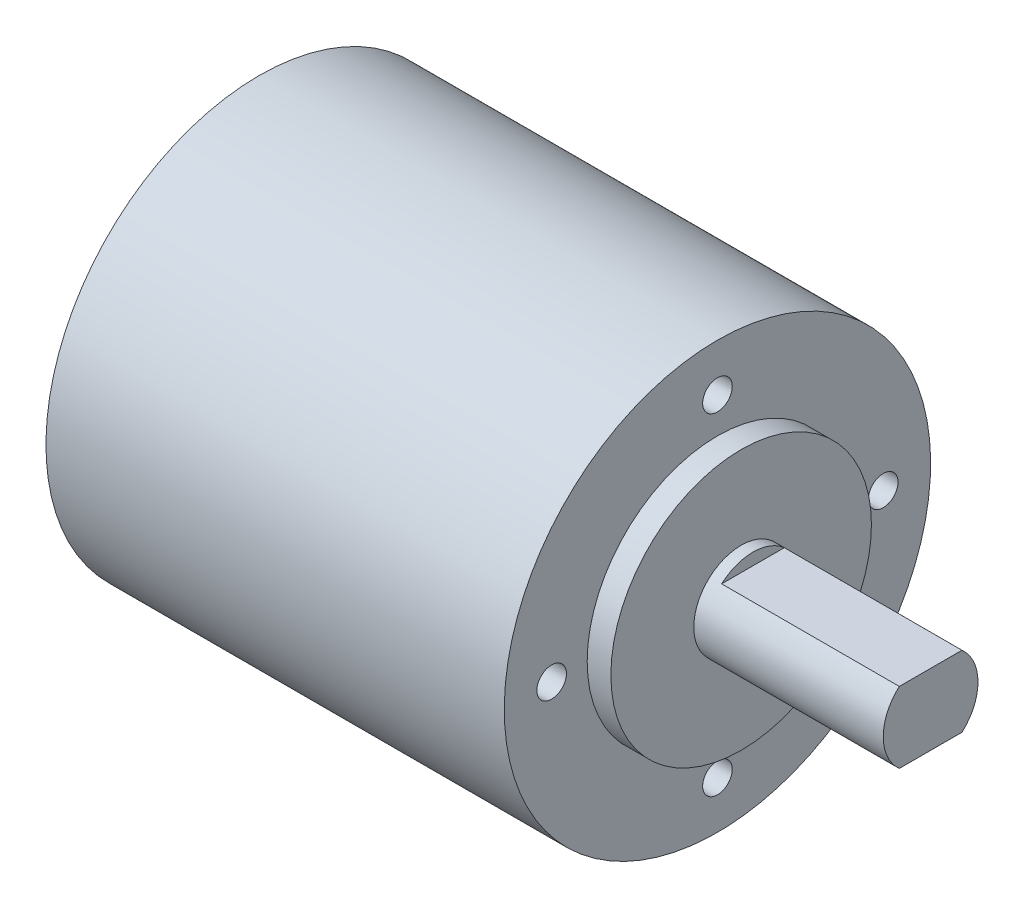
ISO-10303-21;
HEADER;
FILE_DESCRIPTION(('STEP AP214'),'2;1');
FILE_NAME('part.step','',(''),(''),'','','');
FILE_SCHEMA(('AUTOMOTIVE_DESIGN { 1 0 10303 214 1 1 1 1 }'));
ENDSEC;
DATA;
#1=APPLICATION_CONTEXT('core data for automotive mechanical design processes');
#2=APPLICATION_PROTOCOL_DEFINITION('international standard','automotive_design',2000,#1);
#3=PRODUCT_CONTEXT('',#1,'mechanical');
#4=PRODUCT('Part','Part','',(#3));
#5=PRODUCT_RELATED_PRODUCT_CATEGORY('part','',(#4));
#6=PRODUCT_DEFINITION_FORMATION('','',#4);
#7=PRODUCT_DEFINITION_CONTEXT('part definition',#1,'design');
#8=PRODUCT_DEFINITION('design','',#6,#7);
#9=PRODUCT_DEFINITION_SHAPE('','',#8);
#10=(LENGTH_UNIT() NAMED_UNIT(*) SI_UNIT(.MILLI.,.METRE.));
#11=(NAMED_UNIT(*) PLANE_ANGLE_UNIT() SI_UNIT($,.RADIAN.));
#12=(NAMED_UNIT(*) SI_UNIT($,.STERADIAN.) SOLID_ANGLE_UNIT());
#13=UNCERTAINTY_MEASURE_WITH_UNIT(LENGTH_MEASURE(1.E-05),#10,'distance_accuracy_value','');
#14=(GEOMETRIC_REPRESENTATION_CONTEXT(3) GLOBAL_UNCERTAINTY_ASSIGNED_CONTEXT((#13)) GLOBAL_UNIT_ASSIGNED_CONTEXT((#10,
#11,#12)) REPRESENTATION_CONTEXT('',''));
#15=CARTESIAN_POINT('',(0.,0.,0.));
#16=DIRECTION('',(0.,0.,1.));
#17=DIRECTION('',(1.,0.,0.));
#18=AXIS2_PLACEMENT_3D('',#15,#16,#17);
#19=CARTESIAN_POINT('',(56.7,0.,0.));
#20=DIRECTION('',(1.,0.,0.));
#21=DIRECTION('',(0.,1.,0.));
#22=AXIS2_PLACEMENT_3D('',#19,#20,#21);
#23=CYLINDRICAL_SURFACE('',#22,4.);
#24=DIRECTION('',(1.,0.,0.));
#25=VECTOR('',#24,1.);
#26=CARTESIAN_POINT('',(41.7,-3.00000000000001,-2.64575131106459));
#27=LINE('',#26,#25);
#28=CARTESIAN_POINT('',(41.7,-3.00000000000001,-2.64575131106459));
#29=VERTEX_POINT('',#28);
#30=CARTESIAN_POINT('',(56.7,-3.00000000000001,-2.64575131106459));
#31=VERTEX_POINT('',#30);
#32=EDGE_CURVE('E102',#29,#31,#27,.T.);
#33=ORIENTED_EDGE('',*,*,#32,.F.);
#34=CARTESIAN_POINT('',(41.7,0.,0.));
#35=DIRECTION('',(-1.,0.,0.));
#36=DIRECTION('',(0.,-1.,0.));
#37=AXIS2_PLACEMENT_3D('',#34,#35,#36);
#38=CIRCLE('',#37,4.);
#39=CARTESIAN_POINT('',(41.7,-3.,2.64575131106459));
#40=VERTEX_POINT('',#39);
#41=EDGE_CURVE('E108',#29,#40,#38,.T.);
#42=ORIENTED_EDGE('',*,*,#41,.T.);
#43=DIRECTION('',(1.,0.,0.));
#44=VECTOR('',#43,1.);
#45=CARTESIAN_POINT('',(41.7,-3.,2.64575131106459));
#46=LINE('',#45,#44);
#47=CARTESIAN_POINT('',(56.7,-3.,2.64575131106459));
#48=VERTEX_POINT('',#47);
#49=EDGE_CURVE('E105',#40,#48,#46,.T.);
#50=ORIENTED_EDGE('',*,*,#49,.T.);
#51=CARTESIAN_POINT('',(56.7,0.,0.));
#52=DIRECTION('',(1.,0.,0.));
#53=DIRECTION('',(0.,1.,0.));
#54=AXIS2_PLACEMENT_3D('',#51,#52,#53);
#55=CIRCLE('',#54,4.);
#56=CARTESIAN_POINT('',(56.7,3.,2.64575131106459));
#57=VERTEX_POINT('',#56);
#58=EDGE_CURVE('E12',#57,#48,#55,.T.);
#59=ORIENTED_EDGE('',*,*,#58,.F.);
#60=DIRECTION('',(1.,0.,0.));
#61=VECTOR('',#60,1.);
#62=CARTESIAN_POINT('',(41.7,3.,2.64575131106459));
#63=LINE('',#62,#61);
#64=CARTESIAN_POINT('',(41.7,3.,2.64575131106459));
#65=VERTEX_POINT('',#64);
#66=EDGE_CURVE('E71',#65,#57,#63,.T.);
#67=ORIENTED_EDGE('',*,*,#66,.F.);
#68=CARTESIAN_POINT('',(41.7,0.,0.));
#69=DIRECTION('',(1.,0.,0.));
#70=DIRECTION('',(0.,1.,0.));
#71=AXIS2_PLACEMENT_3D('',#68,#69,#70);
#72=CIRCLE('',#71,4.);
#73=CARTESIAN_POINT('',(41.7,3.,-2.6457513110646));
#74=VERTEX_POINT('',#73);
#75=EDGE_CURVE('E78',#74,#65,#72,.T.);
#76=ORIENTED_EDGE('',*,*,#75,.F.);
#77=DIRECTION('',(1.,0.,0.));
#78=VECTOR('',#77,1.);
#79=CARTESIAN_POINT('',(41.7,3.,-2.6457513110646));
#80=LINE('',#79,#78);
#81=CARTESIAN_POINT('',(56.7,3.,-2.6457513110646));
#82=VERTEX_POINT('',#81);
#83=EDGE_CURVE('E120',#74,#82,#80,.T.);
#84=ORIENTED_EDGE('',*,*,#83,.T.);
#85=EDGE_CURVE('E64',#31,#82,#55,.T.);
#86=ORIENTED_EDGE('',*,*,#85,.F.);
#87=EDGE_LOOP('',(#33,#42,#50,#59,#67,#76,#84,#86));
#88=FACE_BOUND('',#87,.T.);
#89=CARTESIAN_POINT('',(40.7,0.,0.));
#90=DIRECTION('',(1.,0.,0.));
#91=DIRECTION('',(0.,1.,0.));
#92=AXIS2_PLACEMENT_3D('',#89,#90,#91);
#93=CIRCLE('',#92,4.);
#94=CARTESIAN_POINT('',(40.7,4.,0.));
#95=VERTEX_POINT('',#94);
#96=EDGE_CURVE('E127',#95,#95,#93,.T.);
#97=ORIENTED_EDGE('',*,*,#96,.T.);
#98=EDGE_LOOP('',(#97));
#99=FACE_BOUND('',#98,.T.);
#100=ADVANCED_FACE('F57',(#88,#99),#23,.T.);
#101=CARTESIAN_POINT('',(56.7,4.,0.));
#102=DIRECTION('',(1.,0.,0.));
#103=DIRECTION('',(0.,1.,0.));
#104=AXIS2_PLACEMENT_3D('',#101,#102,#103);
#105=PLANE('',#104);
#106=DIRECTION('',(0.,0.,-1.));
#107=VECTOR('',#106,1.);
#108=CARTESIAN_POINT('',(56.7,-3.,2.64575131106459));
#109=LINE('',#108,#107);
#110=EDGE_CURVE('E109',#48,#31,#109,.T.);
#111=ORIENTED_EDGE('',*,*,#110,.T.);
#112=ORIENTED_EDGE('',*,*,#85,.T.);
#113=DIRECTION('',(0.,0.,-1.));
#114=VECTOR('',#113,1.);
#115=CARTESIAN_POINT('',(56.7,3.,2.64575131106459));
#116=LINE('',#115,#114);
#117=EDGE_CURVE('E122',#57,#82,#116,.T.);
#118=ORIENTED_EDGE('',*,*,#117,.F.);
#119=ORIENTED_EDGE('',*,*,#58,.T.);
#120=EDGE_LOOP('',(#111,#112,#118,#119));
#121=FACE_BOUND('',#120,.T.);
#122=ADVANCED_FACE('F131',(#121),#105,.T.);
#123=CARTESIAN_POINT('',(40.7,4.,0.));
#124=DIRECTION('',(-1.,0.,0.));
#125=DIRECTION('',(0.,-1.,0.));
#126=AXIS2_PLACEMENT_3D('',#123,#124,#125);
#127=PLANE('',#126);
#128=ORIENTED_EDGE('',*,*,#96,.F.);
#129=EDGE_LOOP('',(#128));
#130=FACE_BOUND('',#129,.T.);
#131=ADVANCED_FACE('F143',(#130),#127,.T.);
#132=CARTESIAN_POINT('',(41.7,3.,2.64575131106459));
#133=DIRECTION('',(0.,-1.,0.));
#134=DIRECTION('',(1.,0.,0.));
#135=AXIS2_PLACEMENT_3D('',#132,#133,#134);
#136=PLANE('',#135);
#137=ORIENTED_EDGE('',*,*,#117,.T.);
#138=ORIENTED_EDGE('',*,*,#83,.F.);
#139=DIRECTION('',(0.,0.,-1.));
#140=VECTOR('',#139,1.);
#141=CARTESIAN_POINT('',(41.7,3.,2.64575131106459));
#142=LINE('',#141,#140);
#143=EDGE_CURVE('E124',#65,#74,#142,.T.);
#144=ORIENTED_EDGE('',*,*,#143,.F.);
#145=ORIENTED_EDGE('',*,*,#66,.T.);
#146=EDGE_LOOP('',(#137,#138,#144,#145));
#147=FACE_BOUND('',#146,.T.);
#148=ADVANCED_FACE('F134',(#147),#136,.F.);
#149=CARTESIAN_POINT('',(41.7,0.,0.));
#150=DIRECTION('',(1.,0.,0.));
#151=DIRECTION('',(0.,1.,0.));
#152=AXIS2_PLACEMENT_3D('',#149,#150,#151);
#153=PLANE('',#152);
#154=ORIENTED_EDGE('',*,*,#143,.T.);
#155=ORIENTED_EDGE('',*,*,#75,.T.);
#156=EDGE_LOOP('',(#154,#155));
#157=FACE_BOUND('',#156,.T.);
#158=ADVANCED_FACE('F135',(#157),#153,.T.);
#159=CARTESIAN_POINT('',(41.7,-3.,2.64575131106459));
#160=DIRECTION('',(0.,-1.,0.));
#161=DIRECTION('',(1.,0.,0.));
#162=AXIS2_PLACEMENT_3D('',#159,#160,#161);
#163=PLANE('',#162);
#164=ORIENTED_EDGE('',*,*,#110,.F.);
#165=ORIENTED_EDGE('',*,*,#49,.F.);
#166=DIRECTION('',(0.,0.,-1.));
#167=VECTOR('',#166,1.);
#168=CARTESIAN_POINT('',(41.7,-3.,2.64575131106459));
#169=LINE('',#168,#167);
#170=EDGE_CURVE('E98',#40,#29,#169,.T.);
#171=ORIENTED_EDGE('',*,*,#170,.T.);
#172=ORIENTED_EDGE('',*,*,#32,.T.);
#173=EDGE_LOOP('',(#164,#165,#171,#172));
#174=FACE_BOUND('',#173,.T.);
#175=ADVANCED_FACE('F100',(#174),#163,.T.);
#176=CARTESIAN_POINT('',(41.7,0.,0.));
#177=DIRECTION('',(1.,0.,0.));
#178=DIRECTION('',(0.,-1.,0.));
#179=AXIS2_PLACEMENT_3D('',#176,#177,#178);
#180=PLANE('',#179);
#181=ORIENTED_EDGE('',*,*,#41,.F.);
#182=ORIENTED_EDGE('',*,*,#170,.F.);
#183=EDGE_LOOP('',(#181,#182));
#184=FACE_BOUND('',#183,.T.);
#185=ADVANCED_FACE('F111',(#184),#180,.T.);
#186=CLOSED_SHELL('',(#100,#122,#131,#148,#158,#175,#185));
#187=MANIFOLD_SOLID_BREP('B2',#186);
#188=CARTESIAN_POINT('',(40.7,0.,0.));
#189=DIRECTION('',(1.,0.,0.));
#190=DIRECTION('',(0.,1.,0.));
#191=AXIS2_PLACEMENT_3D('',#188,#189,#190);
#192=CYLINDRICAL_SURFACE('',#191,18.);
#193=CARTESIAN_POINT('',(0.,0.,0.));
#194=DIRECTION('',(1.,0.,0.));
#195=DIRECTION('',(0.,1.,0.));
#196=AXIS2_PLACEMENT_3D('',#193,#194,#195);
#197=CIRCLE('',#196,18.);
#198=CARTESIAN_POINT('',(0.,18.,0.));
#199=VERTEX_POINT('',#198);
#200=EDGE_CURVE('E296',#199,#199,#197,.T.);
#201=ORIENTED_EDGE('',*,*,#200,.T.);
#202=EDGE_LOOP('',(#201));
#203=FACE_BOUND('',#202,.T.);
#204=CARTESIAN_POINT('',(38.7,0.,0.));
#205=DIRECTION('',(1.,0.,0.));
#206=DIRECTION('',(0.,1.,0.));
#207=AXIS2_PLACEMENT_3D('',#204,#205,#206);
#208=CIRCLE('',#207,18.);
#209=CARTESIAN_POINT('',(38.7,18.,0.));
#210=VERTEX_POINT('',#209);
#211=EDGE_CURVE('E55',#210,#210,#208,.T.);
#212=ORIENTED_EDGE('',*,*,#211,.F.);
#213=EDGE_LOOP('',(#212));
#214=FACE_BOUND('',#213,.T.);
#215=ADVANCED_FACE('F207',(#203,#214),#192,.T.);
#216=CARTESIAN_POINT('',(38.7,18.,0.));
#217=DIRECTION('',(1.,0.,0.));
#218=DIRECTION('',(0.,1.,0.));
#219=AXIS2_PLACEMENT_3D('',#216,#217,#218);
#220=PLANE('',#219);
#221=CARTESIAN_POINT('',(38.7,1.46579491644176E-13,-14.));
#222=DIRECTION('',(1.,0.,0.));
#223=DIRECTION('',(0.,0.,-1.));
#224=AXIS2_PLACEMENT_3D('',#221,#222,#223);
#225=CIRCLE('',#224,1.24999999999999);
#226=CARTESIAN_POINT('',(38.7,1.46579491644176E-13,-15.25));
#227=VERTEX_POINT('',#226);
#228=EDGE_CURVE('E250',#227,#227,#225,.T.);
#229=ORIENTED_EDGE('',*,*,#228,.F.);
#230=EDGE_LOOP('',(#229));
#231=FACE_BOUND('',#230,.T.);
#232=CARTESIAN_POINT('',(38.7,-14.,0.));
#233=DIRECTION('',(1.,0.,0.));
#234=DIRECTION('',(0.,0.,-1.));
#235=AXIS2_PLACEMENT_3D('',#232,#233,#234);
#236=CIRCLE('',#235,1.24999999999999);
#237=CARTESIAN_POINT('',(38.7,-14.,-1.24999999999999));
#238=VERTEX_POINT('',#237);
#239=EDGE_CURVE('E249',#238,#238,#236,.T.);
#240=ORIENTED_EDGE('',*,*,#239,.F.);
#241=EDGE_LOOP('',(#240));
#242=FACE_BOUND('',#241,.T.);
#243=CARTESIAN_POINT('',(38.7,0.,14.));
#244=DIRECTION('',(1.,0.,0.));
#245=DIRECTION('',(0.,0.,-1.));
#246=AXIS2_PLACEMENT_3D('',#243,#244,#245);
#247=CIRCLE('',#246,1.24999999999999);
#248=CARTESIAN_POINT('',(38.7,0.,12.75));
#249=VERTEX_POINT('',#248);
#250=EDGE_CURVE('E260',#249,#249,#247,.T.);
#251=ORIENTED_EDGE('',*,*,#250,.F.);
#252=EDGE_LOOP('',(#251));
#253=FACE_BOUND('',#252,.T.);
#254=CARTESIAN_POINT('',(38.7,14.,0.));
#255=DIRECTION('',(1.,0.,0.));
#256=DIRECTION('',(0.,0.,-1.));
#257=AXIS2_PLACEMENT_3D('',#254,#255,#256);
#258=CIRCLE('',#257,1.24999999999999);
#259=CARTESIAN_POINT('',(38.7,14.,-1.24999999999999));
#260=VERTEX_POINT('',#259);
#261=EDGE_CURVE('E284',#260,#260,#258,.T.);
#262=ORIENTED_EDGE('',*,*,#261,.F.);
#263=EDGE_LOOP('',(#262));
#264=FACE_BOUND('',#263,.T.);
#265=ORIENTED_EDGE('',*,*,#211,.T.);
#266=EDGE_LOOP('',(#265));
#267=FACE_BOUND('',#266,.T.);
#268=CARTESIAN_POINT('',(38.7,0.,0.));
#269=DIRECTION('',(1.,0.,0.));
#270=DIRECTION('',(0.,1.,0.));
#271=AXIS2_PLACEMENT_3D('',#268,#269,#270);
#272=CIRCLE('',#271,11.);
#273=CARTESIAN_POINT('',(38.7,11.,0.));
#274=VERTEX_POINT('',#273);
#275=EDGE_CURVE('E214',#274,#274,#272,.T.);
#276=ORIENTED_EDGE('',*,*,#275,.F.);
#277=EDGE_LOOP('',(#276));
#278=FACE_BOUND('',#277,.T.);
#279=ADVANCED_FACE('F313',(#231,#242,#253,#264,#267,#278),#220,.T.);
#280=CARTESIAN_POINT('',(40.7,0.,0.));
#281=DIRECTION('',(1.,0.,0.));
#282=DIRECTION('',(0.,1.,0.));
#283=AXIS2_PLACEMENT_3D('',#280,#281,#282);
#284=CYLINDRICAL_SURFACE('',#283,11.);
#285=ORIENTED_EDGE('',*,*,#275,.T.);
#286=EDGE_LOOP('',(#285));
#287=FACE_BOUND('',#286,.T.);
#288=CARTESIAN_POINT('',(40.7,0.,0.));
#289=DIRECTION('',(1.,0.,0.));
#290=DIRECTION('',(0.,1.,0.));
#291=AXIS2_PLACEMENT_3D('',#288,#289,#290);
#292=CIRCLE('',#291,11.);
#293=CARTESIAN_POINT('',(40.7,11.,0.));
#294=VERTEX_POINT('',#293);
#295=EDGE_CURVE('E305',#294,#294,#292,.T.);
#296=ORIENTED_EDGE('',*,*,#295,.F.);
#297=EDGE_LOOP('',(#296));
#298=FACE_BOUND('',#297,.T.);
#299=ADVANCED_FACE('F310',(#287,#298),#284,.T.);
#300=CARTESIAN_POINT('',(40.7,11.,0.));
#301=DIRECTION('',(1.,0.,0.));
#302=DIRECTION('',(0.,1.,0.));
#303=AXIS2_PLACEMENT_3D('',#300,#301,#302);
#304=PLANE('',#303);
#305=ORIENTED_EDGE('',*,*,#295,.T.);
#306=EDGE_LOOP('',(#305));
#307=FACE_BOUND('',#306,.T.);
#308=ADVANCED_FACE('F321',(#307),#304,.T.);
#309=CARTESIAN_POINT('',(20.35,7.49999999999999,0.));
#310=DIRECTION('',(-1.,0.,0.));
#311=DIRECTION('',(0.,-1.,0.));
#312=AXIS2_PLACEMENT_3D('',#309,#310,#311);
#313=PLANE('',#312);
#314=CARTESIAN_POINT('',(20.35,0.,0.));
#315=DIRECTION('',(1.,0.,0.));
#316=DIRECTION('',(0.,1.,0.));
#317=AXIS2_PLACEMENT_3D('',#314,#315,#316);
#318=CIRCLE('',#317,7.49999999999999);
#319=CARTESIAN_POINT('',(20.35,7.49999999999999,0.));
#320=VERTEX_POINT('',#319);
#321=EDGE_CURVE('E302',#320,#320,#318,.T.);
#322=ORIENTED_EDGE('',*,*,#321,.F.);
#323=EDGE_LOOP('',(#322));
#324=FACE_BOUND('',#323,.T.);
#325=ADVANCED_FACE('F330',(#324),#313,.T.);
#326=CARTESIAN_POINT('',(40.7,0.,0.));
#327=DIRECTION('',(1.,0.,0.));
#328=DIRECTION('',(0.,1.,0.));
#329=AXIS2_PLACEMENT_3D('',#326,#327,#328);
#330=CYLINDRICAL_SURFACE('',#329,7.49999999999999);
#331=ORIENTED_EDGE('',*,*,#321,.T.);
#332=EDGE_LOOP('',(#331));
#333=FACE_BOUND('',#332,.T.);
#334=CARTESIAN_POINT('',(0.,0.,0.));
#335=DIRECTION('',(1.,0.,0.));
#336=DIRECTION('',(0.,1.,0.));
#337=AXIS2_PLACEMENT_3D('',#334,#335,#336);
#338=CIRCLE('',#337,7.49999999999999);
#339=CARTESIAN_POINT('',(0.,7.49999999999999,0.));
#340=VERTEX_POINT('',#339);
#341=EDGE_CURVE('E299',#340,#340,#338,.T.);
#342=ORIENTED_EDGE('',*,*,#341,.F.);
#343=EDGE_LOOP('',(#342));
#344=FACE_BOUND('',#343,.T.);
#345=ADVANCED_FACE('F334',(#333,#344),#330,.F.);
#346=CARTESIAN_POINT('',(0.,7.49999999999999,0.));
#347=DIRECTION('',(-1.,0.,0.));
#348=DIRECTION('',(0.,-1.,0.));
#349=AXIS2_PLACEMENT_3D('',#346,#347,#348);
#350=PLANE('',#349);
#351=CARTESIAN_POINT('',(0.,1.46642216231412E-13,-14.));
#352=DIRECTION('',(-1.,0.,0.));
#353=DIRECTION('',(0.,0.,1.));
#354=AXIS2_PLACEMENT_3D('',#351,#352,#353);
#355=CIRCLE('',#354,1.25);
#356=CARTESIAN_POINT('',(0.,1.46642216231412E-13,-12.75));
#357=VERTEX_POINT('',#356);
#358=EDGE_CURVE('E266',#357,#357,#355,.T.);
#359=ORIENTED_EDGE('',*,*,#358,.F.);
#360=EDGE_LOOP('',(#359));
#361=FACE_BOUND('',#360,.T.);
#362=CARTESIAN_POINT('',(0.,-14.,0.));
#363=DIRECTION('',(-1.,0.,0.));
#364=DIRECTION('',(0.,0.,1.));
#365=AXIS2_PLACEMENT_3D('',#362,#363,#364);
#366=CIRCLE('',#365,1.25);
#367=CARTESIAN_POINT('',(0.,-14.,1.25));
#368=VERTEX_POINT('',#367);
#369=EDGE_CURVE('E272',#368,#368,#366,.T.);
#370=ORIENTED_EDGE('',*,*,#369,.F.);
#371=EDGE_LOOP('',(#370));
#372=FACE_BOUND('',#371,.T.);
#373=CARTESIAN_POINT('',(0.,0.,14.));
#374=DIRECTION('',(-1.,0.,0.));
#375=DIRECTION('',(0.,0.,1.));
#376=AXIS2_PLACEMENT_3D('',#373,#374,#375);
#377=CIRCLE('',#376,1.25);
#378=CARTESIAN_POINT('',(0.,0.,15.25));
#379=VERTEX_POINT('',#378);
#380=EDGE_CURVE('E278',#379,#379,#377,.T.);
#381=ORIENTED_EDGE('',*,*,#380,.F.);
#382=EDGE_LOOP('',(#381));
#383=FACE_BOUND('',#382,.T.);
#384=CARTESIAN_POINT('',(0.,14.,0.));
#385=DIRECTION('',(-1.,0.,0.));
#386=DIRECTION('',(0.,0.,1.));
#387=AXIS2_PLACEMENT_3D('',#384,#385,#386);
#388=CIRCLE('',#387,1.25);
#389=CARTESIAN_POINT('',(0.,14.,1.25));
#390=VERTEX_POINT('',#389);
#391=EDGE_CURVE('E290',#390,#390,#388,.T.);
#392=ORIENTED_EDGE('',*,*,#391,.F.);
#393=EDGE_LOOP('',(#392));
#394=FACE_BOUND('',#393,.T.);
#395=ORIENTED_EDGE('',*,*,#341,.T.);
#396=EDGE_LOOP('',(#395));
#397=FACE_BOUND('',#396,.T.);
#398=ORIENTED_EDGE('',*,*,#200,.F.);
#399=EDGE_LOOP('',(#398));
#400=FACE_BOUND('',#399,.T.);
#401=ADVANCED_FACE('F338',(#361,#372,#383,#394,#397,#400),#350,.T.);
#402=CARTESIAN_POINT('',(5.,14.,0.));
#403=DIRECTION('',(-1.,0.,0.));
#404=DIRECTION('',(0.,0.,1.));
#405=AXIS2_PLACEMENT_3D('',#402,#403,#404);
#406=CONICAL_SURFACE('',#405,1.25,1.02974425867665);
#407=CARTESIAN_POINT('',(5.75107577378445,14.,0.));
#408=VERTEX_POINT('',#407);
#409=VERTEX_LOOP('',#408);
#410=FACE_BOUND('',#409,.T.);
#411=CARTESIAN_POINT('',(5.,14.,0.));
#412=DIRECTION('',(-1.,0.,0.));
#413=DIRECTION('',(0.,0.,1.));
#414=AXIS2_PLACEMENT_3D('',#411,#412,#413);
#415=CIRCLE('',#414,1.25);
#416=CARTESIAN_POINT('',(5.,14.,1.25));
#417=VERTEX_POINT('',#416);
#418=EDGE_CURVE('E293',#417,#417,#415,.T.);
#419=ORIENTED_EDGE('',*,*,#418,.T.);
#420=EDGE_LOOP('',(#419));
#421=FACE_BOUND('',#420,.T.);
#422=ADVANCED_FACE('F342',(#410,#421),#406,.F.);
#423=CARTESIAN_POINT('',(0.,14.,0.));
#424=DIRECTION('',(-1.,0.,0.));
#425=DIRECTION('',(0.,0.,1.));
#426=AXIS2_PLACEMENT_3D('',#423,#424,#425);
#427=CYLINDRICAL_SURFACE('',#426,1.25);
#428=ORIENTED_EDGE('',*,*,#418,.F.);
#429=EDGE_LOOP('',(#428));
#430=FACE_BOUND('',#429,.T.);
#431=ORIENTED_EDGE('',*,*,#391,.T.);
#432=EDGE_LOOP('',(#431));
#433=FACE_BOUND('',#432,.T.);
#434=ADVANCED_FACE('F346',(#430,#433),#427,.F.);
#435=CARTESIAN_POINT('',(33.7,14.,0.));
#436=DIRECTION('',(1.,0.,0.));
#437=DIRECTION('',(0.,0.,-1.));
#438=AXIS2_PLACEMENT_3D('',#435,#436,#437);
#439=CONICAL_SURFACE('',#438,1.25,1.02974425867665);
#440=CARTESIAN_POINT('',(32.9489242262156,14.,0.));
#441=VERTEX_POINT('',#440);
#442=VERTEX_LOOP('',#441);
#443=FACE_BOUND('',#442,.T.);
#444=CARTESIAN_POINT('',(33.7,14.,0.));
#445=DIRECTION('',(1.,0.,0.));
#446=DIRECTION('',(0.,0.,-1.));
#447=AXIS2_PLACEMENT_3D('',#444,#445,#446);
#448=CIRCLE('',#447,1.25);
#449=CARTESIAN_POINT('',(33.7,14.,-1.25));
#450=VERTEX_POINT('',#449);
#451=EDGE_CURVE('E287',#450,#450,#448,.T.);
#452=ORIENTED_EDGE('',*,*,#451,.T.);
#453=EDGE_LOOP('',(#452));
#454=FACE_BOUND('',#453,.T.);
#455=ADVANCED_FACE('F349',(#443,#454),#439,.F.);
#456=CARTESIAN_POINT('',(38.7,14.,0.));
#457=DIRECTION('',(1.,0.,0.));
#458=DIRECTION('',(0.,0.,-1.));
#459=AXIS2_PLACEMENT_3D('',#456,#457,#458);
#460=CYLINDRICAL_SURFACE('',#459,1.24999999999999);
#461=ORIENTED_EDGE('',*,*,#451,.F.);
#462=EDGE_LOOP('',(#461));
#463=FACE_BOUND('',#462,.T.);
#464=ORIENTED_EDGE('',*,*,#261,.T.);
#465=EDGE_LOOP('',(#464));
#466=FACE_BOUND('',#465,.T.);
#467=ADVANCED_FACE('F353',(#463,#466),#460,.F.);
#468=CARTESIAN_POINT('',(5.,0.,14.));
#469=DIRECTION('',(-1.,0.,0.));
#470=DIRECTION('',(0.,0.,1.));
#471=AXIS2_PLACEMENT_3D('',#468,#469,#470);
#472=CONICAL_SURFACE('',#471,1.25,1.02974425867665);
#473=CARTESIAN_POINT('',(5.75107577378445,0.,14.));
#474=VERTEX_POINT('',#473);
#475=VERTEX_LOOP('',#474);
#476=FACE_BOUND('',#475,.T.);
#477=CARTESIAN_POINT('',(5.,0.,14.));
#478=DIRECTION('',(-1.,0.,0.));
#479=DIRECTION('',(0.,0.,1.));
#480=AXIS2_PLACEMENT_3D('',#477,#478,#479);
#481=CIRCLE('',#480,1.25);
#482=CARTESIAN_POINT('',(5.,0.,15.25));
#483=VERTEX_POINT('',#482);
#484=EDGE_CURVE('E281',#483,#483,#481,.T.);
#485=ORIENTED_EDGE('',*,*,#484,.T.);
#486=EDGE_LOOP('',(#485));
#487=FACE_BOUND('',#486,.T.);
#488=ADVANCED_FACE('F356',(#476,#487),#472,.F.);
#489=CARTESIAN_POINT('',(0.,0.,14.));
#490=DIRECTION('',(-1.,0.,0.));
#491=DIRECTION('',(0.,0.,1.));
#492=AXIS2_PLACEMENT_3D('',#489,#490,#491);
#493=CYLINDRICAL_SURFACE('',#492,1.25);
#494=ORIENTED_EDGE('',*,*,#484,.F.);
#495=EDGE_LOOP('',(#494));
#496=FACE_BOUND('',#495,.T.);
#497=ORIENTED_EDGE('',*,*,#380,.T.);
#498=EDGE_LOOP('',(#497));
#499=FACE_BOUND('',#498,.T.);
#500=ADVANCED_FACE('F360',(#496,#499),#493,.F.);
#501=CARTESIAN_POINT('',(5.,-14.,0.));
#502=DIRECTION('',(-1.,0.,0.));
#503=DIRECTION('',(0.,0.,1.));
#504=AXIS2_PLACEMENT_3D('',#501,#502,#503);
#505=CONICAL_SURFACE('',#504,1.25,1.02974425867665);
#506=CARTESIAN_POINT('',(5.75107577378445,-14.,0.));
#507=VERTEX_POINT('',#506);
#508=VERTEX_LOOP('',#507);
#509=FACE_BOUND('',#508,.T.);
#510=CARTESIAN_POINT('',(5.,-14.,0.));
#511=DIRECTION('',(-1.,0.,0.));
#512=DIRECTION('',(0.,0.,1.));
#513=AXIS2_PLACEMENT_3D('',#510,#511,#512);
#514=CIRCLE('',#513,1.25);
#515=CARTESIAN_POINT('',(5.,-14.,1.25));
#516=VERTEX_POINT('',#515);
#517=EDGE_CURVE('E275',#516,#516,#514,.T.);
#518=ORIENTED_EDGE('',*,*,#517,.T.);
#519=EDGE_LOOP('',(#518));
#520=FACE_BOUND('',#519,.T.);
#521=ADVANCED_FACE('F364',(#509,#520),#505,.F.);
#522=CARTESIAN_POINT('',(0.,-14.,0.));
#523=DIRECTION('',(-1.,0.,0.));
#524=DIRECTION('',(0.,0.,1.));
#525=AXIS2_PLACEMENT_3D('',#522,#523,#524);
#526=CYLINDRICAL_SURFACE('',#525,1.25);
#527=ORIENTED_EDGE('',*,*,#517,.F.);
#528=EDGE_LOOP('',(#527));
#529=FACE_BOUND('',#528,.T.);
#530=ORIENTED_EDGE('',*,*,#369,.T.);
#531=EDGE_LOOP('',(#530));
#532=FACE_BOUND('',#531,.T.);
#533=ADVANCED_FACE('F368',(#529,#532),#526,.F.);
#534=CARTESIAN_POINT('',(5.,1.46642216231412E-13,-14.));
#535=DIRECTION('',(-1.,0.,0.));
#536=DIRECTION('',(0.,0.,1.));
#537=AXIS2_PLACEMENT_3D('',#534,#535,#536);
#538=CONICAL_SURFACE('',#537,1.25,1.02974425867665);
#539=CARTESIAN_POINT('',(5.75107577378445,1.45233608923808E-13,-14.));
#540=VERTEX_POINT('',#539);
#541=VERTEX_LOOP('',#540);
#542=FACE_BOUND('',#541,.T.);
#543=CARTESIAN_POINT('',(5.,1.46642216231412E-13,-14.));
#544=DIRECTION('',(-1.,0.,0.));
#545=DIRECTION('',(0.,0.,1.));
#546=AXIS2_PLACEMENT_3D('',#543,#544,#545);
#547=CIRCLE('',#546,1.25);
#548=CARTESIAN_POINT('',(5.,1.46642216231412E-13,-12.75));
#549=VERTEX_POINT('',#548);
#550=EDGE_CURVE('E269',#549,#549,#547,.T.);
#551=ORIENTED_EDGE('',*,*,#550,.T.);
#552=EDGE_LOOP('',(#551));
#553=FACE_BOUND('',#552,.T.);
#554=ADVANCED_FACE('F372',(#542,#553),#538,.F.);
#555=CARTESIAN_POINT('',(0.,1.46642216231412E-13,-14.));
#556=DIRECTION('',(-1.,0.,0.));
#557=DIRECTION('',(0.,0.,1.));
#558=AXIS2_PLACEMENT_3D('',#555,#556,#557);
#559=CYLINDRICAL_SURFACE('',#558,1.25);
#560=ORIENTED_EDGE('',*,*,#550,.F.);
#561=EDGE_LOOP('',(#560));
#562=FACE_BOUND('',#561,.T.);
#563=ORIENTED_EDGE('',*,*,#358,.T.);
#564=EDGE_LOOP('',(#563));
#565=FACE_BOUND('',#564,.T.);
#566=ADVANCED_FACE('F376',(#562,#565),#559,.F.);
#567=CARTESIAN_POINT('',(33.7,0.,14.));
#568=DIRECTION('',(1.,0.,0.));
#569=DIRECTION('',(0.,0.,-1.));
#570=AXIS2_PLACEMENT_3D('',#567,#568,#569);
#571=CONICAL_SURFACE('',#570,1.25,1.02974425867665);
#572=CARTESIAN_POINT('',(32.9489242262156,0.,14.));
#573=VERTEX_POINT('',#572);
#574=VERTEX_LOOP('',#573);
#575=FACE_BOUND('',#574,.T.);
#576=CARTESIAN_POINT('',(33.7,0.,14.));
#577=DIRECTION('',(1.,0.,0.));
#578=DIRECTION('',(0.,0.,-1.));
#579=AXIS2_PLACEMENT_3D('',#576,#577,#578);
#580=CIRCLE('',#579,1.25);
#581=CARTESIAN_POINT('',(33.7,0.,12.75));
#582=VERTEX_POINT('',#581);
#583=EDGE_CURVE('E263',#582,#582,#580,.T.);
#584=ORIENTED_EDGE('',*,*,#583,.T.);
#585=EDGE_LOOP('',(#584));
#586=FACE_BOUND('',#585,.T.);
#587=ADVANCED_FACE('F380',(#575,#586),#571,.F.);
#588=CARTESIAN_POINT('',(38.7,0.,14.));
#589=DIRECTION('',(1.,0.,0.));
#590=DIRECTION('',(0.,0.,-1.));
#591=AXIS2_PLACEMENT_3D('',#588,#589,#590);
#592=CYLINDRICAL_SURFACE('',#591,1.24999999999999);
#593=ORIENTED_EDGE('',*,*,#583,.F.);
#594=EDGE_LOOP('',(#593));
#595=FACE_BOUND('',#594,.T.);
#596=ORIENTED_EDGE('',*,*,#250,.T.);
#597=EDGE_LOOP('',(#596));
#598=FACE_BOUND('',#597,.T.);
#599=ADVANCED_FACE('F384',(#595,#598),#592,.F.);
#600=CARTESIAN_POINT('',(33.7,-14.,0.));
#601=DIRECTION('',(1.,0.,0.));
#602=DIRECTION('',(0.,0.,-1.));
#603=AXIS2_PLACEMENT_3D('',#600,#601,#602);
#604=CONICAL_SURFACE('',#603,1.25,1.02974425867665);
#605=CARTESIAN_POINT('',(32.9489242262156,-14.,0.));
#606=VERTEX_POINT('',#605);
#607=VERTEX_LOOP('',#606);
#608=FACE_BOUND('',#607,.T.);
#609=CARTESIAN_POINT('',(33.7,-14.,0.));
#610=DIRECTION('',(1.,0.,0.));
#611=DIRECTION('',(0.,0.,-1.));
#612=AXIS2_PLACEMENT_3D('',#609,#610,#611);
#613=CIRCLE('',#612,1.25);
#614=CARTESIAN_POINT('',(33.7,-14.,-1.25));
#615=VERTEX_POINT('',#614);
#616=EDGE_CURVE('E253',#615,#615,#613,.T.);
#617=ORIENTED_EDGE('',*,*,#616,.T.);
#618=EDGE_LOOP('',(#617));
#619=FACE_BOUND('',#618,.T.);
#620=ADVANCED_FACE('F388',(#608,#619),#604,.F.);
#621=CARTESIAN_POINT('',(38.7,-14.,0.));
#622=DIRECTION('',(1.,0.,0.));
#623=DIRECTION('',(0.,0.,-1.));
#624=AXIS2_PLACEMENT_3D('',#621,#622,#623);
#625=CYLINDRICAL_SURFACE('',#624,1.24999999999999);
#626=ORIENTED_EDGE('',*,*,#616,.F.);
#627=EDGE_LOOP('',(#626));
#628=FACE_BOUND('',#627,.T.);
#629=ORIENTED_EDGE('',*,*,#239,.T.);
#630=EDGE_LOOP('',(#629));
#631=FACE_BOUND('',#630,.T.);
#632=ADVANCED_FACE('F243',(#628,#631),#625,.F.);
#633=CARTESIAN_POINT('',(33.7,1.46579491644176E-13,-14.));
#634=DIRECTION('',(1.,0.,0.));
#635=DIRECTION('',(0.,0.,-1.));
#636=AXIS2_PLACEMENT_3D('',#633,#634,#635);
#637=CONICAL_SURFACE('',#636,1.25,1.02974425867665);
#638=CARTESIAN_POINT('',(32.9489242262156,1.45170884336572E-13,-14.));
#639=VERTEX_POINT('',#638);
#640=VERTEX_LOOP('',#639);
#641=FACE_BOUND('',#640,.T.);
#642=CARTESIAN_POINT('',(33.7,1.46579491644176E-13,-14.));
#643=DIRECTION('',(1.,0.,0.));
#644=DIRECTION('',(0.,0.,-1.));
#645=AXIS2_PLACEMENT_3D('',#642,#643,#644);
#646=CIRCLE('',#645,1.25);
#647=CARTESIAN_POINT('',(33.7,1.46579491644176E-13,-15.25));
#648=VERTEX_POINT('',#647);
#649=EDGE_CURVE('E247',#648,#648,#646,.T.);
#650=ORIENTED_EDGE('',*,*,#649,.T.);
#651=EDGE_LOOP('',(#650));
#652=FACE_BOUND('',#651,.T.);
#653=ADVANCED_FACE('F239',(#641,#652),#637,.F.);
#654=CARTESIAN_POINT('',(38.7,1.46579491644176E-13,-14.));
#655=DIRECTION('',(1.,0.,0.));
#656=DIRECTION('',(0.,0.,-1.));
#657=AXIS2_PLACEMENT_3D('',#654,#655,#656);
#658=CYLINDRICAL_SURFACE('',#657,1.24999999999999);
#659=ORIENTED_EDGE('',*,*,#649,.F.);
#660=EDGE_LOOP('',(#659));
#661=FACE_BOUND('',#660,.T.);
#662=ORIENTED_EDGE('',*,*,#228,.T.);
#663=EDGE_LOOP('',(#662));
#664=FACE_BOUND('',#663,.T.);
#665=ADVANCED_FACE('F242',(#661,#664),#658,.F.);
#666=CLOSED_SHELL('',(#215,#279,#299,#308,#325,#345,#401,#422,#434,#455,#467,#488,#500,#521,
#533,#554,#566,#587,#599,#620,#632,#653,#665));
#667=MANIFOLD_SOLID_BREP('B6',#666);
#668=ADVANCED_BREP_SHAPE_REPRESENTATION('',(#18,#187,#667),#14);
#669=SHAPE_DEFINITION_REPRESENTATION(#9,#668);
ENDSEC;
END-ISO-10303-21;
